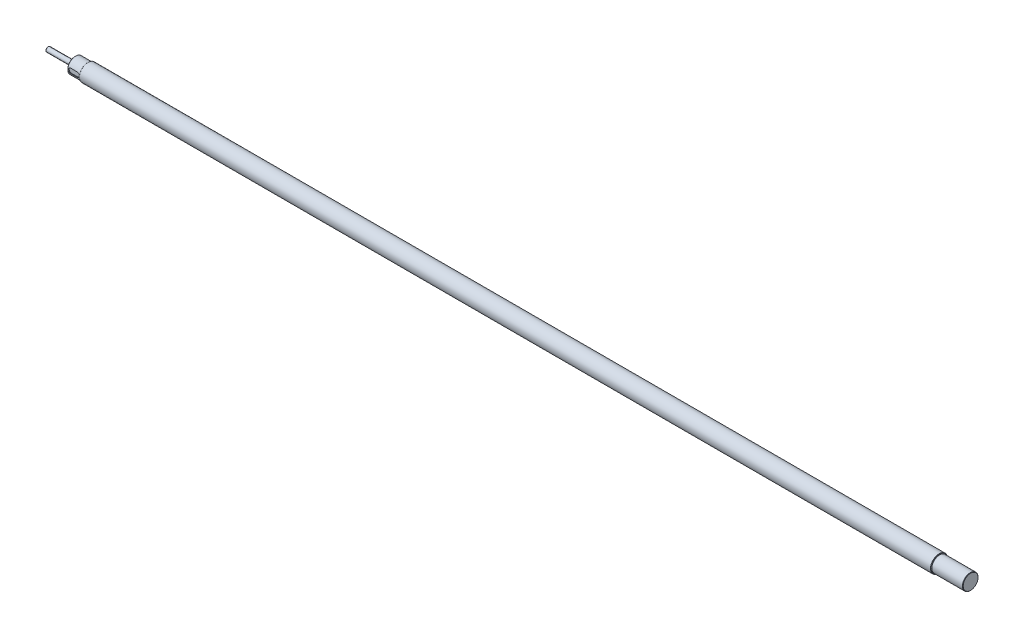
ISO-10303-21;
HEADER;
FILE_DESCRIPTION(('STEP AP214'),'2;1');
FILE_NAME('part.step','',(''),(''),'','','');
FILE_SCHEMA(('AUTOMOTIVE_DESIGN { 1 0 10303 214 1 1 1 1 }'));
ENDSEC;
DATA;
#1=APPLICATION_CONTEXT('core data for automotive mechanical design processes');
#2=APPLICATION_PROTOCOL_DEFINITION('international standard','automotive_design',2000,#1);
#3=PRODUCT_CONTEXT('',#1,'mechanical');
#4=PRODUCT('Part','Part','',(#3));
#5=PRODUCT_RELATED_PRODUCT_CATEGORY('part','',(#4));
#6=PRODUCT_DEFINITION_FORMATION('','',#4);
#7=PRODUCT_DEFINITION_CONTEXT('part definition',#1,'design');
#8=PRODUCT_DEFINITION('design','',#6,#7);
#9=PRODUCT_DEFINITION_SHAPE('','',#8);
#10=(LENGTH_UNIT() NAMED_UNIT(*) SI_UNIT(.MILLI.,.METRE.));
#11=(NAMED_UNIT(*) PLANE_ANGLE_UNIT() SI_UNIT($,.RADIAN.));
#12=(NAMED_UNIT(*) SI_UNIT($,.STERADIAN.) SOLID_ANGLE_UNIT());
#13=UNCERTAINTY_MEASURE_WITH_UNIT(LENGTH_MEASURE(1.E-05),#10,'distance_accuracy_value','');
#14=(GEOMETRIC_REPRESENTATION_CONTEXT(3) GLOBAL_UNCERTAINTY_ASSIGNED_CONTEXT((#13)) GLOBAL_UNIT_ASSIGNED_CONTEXT((#10,
#11,#12)) REPRESENTATION_CONTEXT('',''));
#15=CARTESIAN_POINT('',(0.,0.,0.));
#16=DIRECTION('',(0.,0.,1.));
#17=DIRECTION('',(1.,0.,0.));
#18=AXIS2_PLACEMENT_3D('',#15,#16,#17);
#19=CARTESIAN_POINT('',(51.,-1.17961196366423E-12,0.));
#20=DIRECTION('',(-1.,0.,0.));
#21=DIRECTION('',(0.,0.,1.));
#22=AXIS2_PLACEMENT_3D('',#19,#20,#21);
#23=PLANE('',#22);
#24=CARTESIAN_POINT('',(51.,0.,0.));
#25=DIRECTION('',(-1.,0.,0.));
#26=DIRECTION('',(0.,0.,1.));
#27=AXIS2_PLACEMENT_3D('',#24,#25,#26);
#28=CIRCLE('',#27,10.5);
#29=CARTESIAN_POINT('',(51.,0.,10.5));
#30=VERTEX_POINT('',#29);
#31=EDGE_CURVE('E123',#30,#30,#28,.T.);
#32=ORIENTED_EDGE('',*,*,#31,.T.);
#33=EDGE_LOOP('',(#32));
#34=FACE_BOUND('',#33,.T.);
#35=CARTESIAN_POINT('',(51.,0.,0.));
#36=DIRECTION('',(-1.,0.,0.));
#37=DIRECTION('',(0.,0.,1.));
#38=AXIS2_PLACEMENT_3D('',#35,#36,#37);
#39=CIRCLE('',#38,10.2);
#40=CARTESIAN_POINT('',(51.,0.,10.2));
#41=VERTEX_POINT('',#40);
#42=EDGE_CURVE('E189',#41,#41,#39,.T.);
#43=ORIENTED_EDGE('',*,*,#42,.F.);
#44=EDGE_LOOP('',(#43));
#45=FACE_BOUND('',#44,.T.);
#46=ADVANCED_FACE('F41',(#34,#45),#23,.T.);
#47=CARTESIAN_POINT('',(50.8,0.,0.));
#48=DIRECTION('',(-1.,0.,0.));
#49=DIRECTION('',(0.,0.,1.));
#50=AXIS2_PLACEMENT_3D('',#47,#48,#49);
#51=TOROIDAL_SURFACE('',#50,10.2,0.199999999999995);
#52=CARTESIAN_POINT('',(50.8,0.,0.));
#53=DIRECTION('',(-1.,0.,0.));
#54=DIRECTION('',(0.,0.,1.));
#55=AXIS2_PLACEMENT_3D('',#52,#53,#54);
#56=CIRCLE('',#55,10.);
#57=CARTESIAN_POINT('',(50.8,0.,10.));
#58=VERTEX_POINT('',#57);
#59=EDGE_CURVE('E185',#58,#58,#56,.T.);
#60=ORIENTED_EDGE('',*,*,#59,.F.);
#61=EDGE_LOOP('',(#60));
#62=FACE_BOUND('',#61,.T.);
#63=ORIENTED_EDGE('',*,*,#42,.T.);
#64=EDGE_LOOP('',(#63));
#65=FACE_BOUND('',#64,.T.);
#66=ADVANCED_FACE('F233',(#62,#65),#51,.F.);
#67=CARTESIAN_POINT('',(0.,0.,0.));
#68=DIRECTION('',(-1.,0.,0.));
#69=DIRECTION('',(0.,0.,1.));
#70=AXIS2_PLACEMENT_3D('',#67,#68,#69);
#71=CYLINDRICAL_SURFACE('',#70,10.);
#72=CARTESIAN_POINT('',(47.,-3.,9.53939201416946));
#73=CARTESIAN_POINT('',(47.0823355208227,-3.00001027845728,9.53938054248207));
#74=CARTESIAN_POINT('',(47.1646644550632,-2.99661062684472,9.54045772064378));
#75=CARTESIAN_POINT('',(47.3286939527655,-2.98307142899347,9.54470412105986));
#76=CARTESIAN_POINT('',(47.4103946533244,-2.97293339805418,9.54787287296849));
#77=CARTESIAN_POINT('',(47.5723849156732,-2.94603140625045,9.55620668351003));
#78=CARTESIAN_POINT('',(47.652677524043,-2.92928426957737,9.56136667250114));
#79=CARTESIAN_POINT('',(47.8114758441342,-2.88932853030394,9.57351626651178));
#80=CARTESIAN_POINT('',(47.8899815090674,-2.8661197587264,9.58050591937828));
#81=CARTESIAN_POINT('',(48.1219493879902,-2.78708584446024,9.60391637654137));
#82=CARTESIAN_POINT('',(48.272068438833,-2.72181852542972,9.62279007830391));
#83=CARTESIAN_POINT('',(48.5592260439791,-2.56815043531276,9.66493213967819));
#84=CARTESIAN_POINT('',(48.6962584707622,-2.47973889924159,9.68820254290641));
#85=CARTESIAN_POINT('',(48.9577229879478,-2.27929879634442,9.73733650515375));
#86=CARTESIAN_POINT('',(49.0816848740609,-2.16666914746584,9.76325505469874));
#87=CARTESIAN_POINT('',(49.3092736148388,-1.92227736150432,9.81429628475077));
#88=CARTESIAN_POINT('',(49.412897033861,-1.79051199848163,9.8394188301941));
#89=CARTESIAN_POINT('',(49.5989268650946,-1.50821997465696,9.88666477976535));
#90=CARTESIAN_POINT('',(49.6808501797826,-1.35736167401015,9.90871541546878));
#91=CARTESIAN_POINT('',(49.8179770040029,-1.04324233568302,9.94668940088144));
#92=CARTESIAN_POINT('',(49.873187403368,-0.879984508687981,9.96261433032403));
#93=CARTESIAN_POINT('',(49.953759551791,-0.550649404820599,9.98615279768398));
#94=CARTESIAN_POINT('',(49.9799297035176,-0.384786253016201,9.99399098526792));
#95=CARTESIAN_POINT('',(50.004234695146,-0.0508471415689268,10.0012640407204));
#96=CARTESIAN_POINT('',(50.0023748426782,0.11722839312534,10.0007004995012));
#97=CARTESIAN_POINT('',(49.9712141793086,0.445143199271825,9.99139205125586));
#98=CARTESIAN_POINT('',(49.9427893091919,0.605074290763029,9.98290831016512));
#99=CARTESIAN_POINT('',(49.8607367303745,0.917780104370315,9.95903027401822));
#100=CARTESIAN_POINT('',(49.8071077013173,1.07055445110879,9.94363561692558));
#101=CARTESIAN_POINT('',(49.6755755564753,1.36669563173912,9.90730429851782));
#102=CARTESIAN_POINT('',(49.5973967112239,1.50993201207613,9.88630511384915));
#103=CARTESIAN_POINT('',(49.4192028199656,1.781531059161,9.84099249303647));
#104=CARTESIAN_POINT('',(49.3191828810593,1.90989038323251,9.81667831471806));
#105=CARTESIAN_POINT('',(49.0956160238154,2.15330901082206,9.7662334714278));
#106=CARTESIAN_POINT('',(48.9713122724738,2.26766702955975,9.74006890899097));
#107=CARTESIAN_POINT('',(48.7050051531489,2.47413538985067,9.68968430229327));
#108=CARTESIAN_POINT('',(48.5629966392702,2.5662392402618,9.66546482675134));
#109=CARTESIAN_POINT('',(48.2634381431001,2.72632814481701,9.62154457591303));
#110=CARTESIAN_POINT('',(48.1057456408129,2.79406012682263,9.60189192491896));
#111=CARTESIAN_POINT('',(47.7805509920369,2.90171772009404,9.56991327306403));
#112=CARTESIAN_POINT('',(47.6130642785713,2.94168586436072,9.5575760695175));
#113=CARTESIAN_POINT('',(47.3700102218596,2.97802407180159,9.54628064650012));
#114=CARTESIAN_POINT('',(47.2962185316408,2.98626405978017,9.54370312550534));
#115=CARTESIAN_POINT('',(47.148297041801,2.99724711229709,9.54025857223565));
#116=CARTESIAN_POINT('',(47.0741679006723,2.99999825936538,9.53938902493288));
#117=CARTESIAN_POINT('',(47.,3.,9.53939201416946));
#118=B_SPLINE_CURVE_WITH_KNOTS('',3,(#72,#73,#74,#75,#76,#77,#78,#79,#80,#81,#82,#83,#84,#85,
#86,#87,#88,#89,#90,#91,#92,#93,#94,#95,#96,#97,#98,#99,#100,#101,#102,#103,#104,#105,#106,#107,
#108,#109,#110,#111,#112,#113,#114,#115,#116,#117),.UNSPECIFIED.,.F.,.F.,(4,2,2,2,2,2,2,2,2,2,2,
2,2,2,2,2,2,2,2,2,2,2,4),(0.,0.246918142439474,0.493780777706094,0.740019009623013,
0.986263681482027,1.47813347402026,1.97023245590779,2.47635119822767,2.98255536239034,
3.49922810620071,4.01576751791672,4.51753600864764,5.01920948804101,5.50490358251093,
5.99062312360831,6.48200583350621,6.9734987373917,7.48389234847122,7.99443465298715,
8.51013494368214,9.02504345105574,9.24774267716779,9.47011372732391),.UNSPECIFIED.);
#119=CARTESIAN_POINT('',(47.,-3.,9.53939201416946));
#120=VERTEX_POINT('',#119);
#121=CARTESIAN_POINT('',(47.,3.,9.53939201416946));
#122=VERTEX_POINT('',#121);
#123=EDGE_CURVE('E193',#120,#122,#118,.T.);
#124=ORIENTED_EDGE('',*,*,#123,.F.);
#125=DIRECTION('',(-1.,0.,0.));
#126=VECTOR('',#125,1.);
#127=CARTESIAN_POINT('',(0.,-3.,9.53939201416946));
#128=LINE('',#127,#126);
#129=CARTESIAN_POINT('',(39.,-3.,9.53939201416946));
#130=VERTEX_POINT('',#129);
#131=EDGE_CURVE('E54',#130,#120,#128,.F.);
#132=ORIENTED_EDGE('',*,*,#131,.F.);
#133=CARTESIAN_POINT('',(39.,3.,9.53939201416946));
#134=CARTESIAN_POINT('',(38.9176644791773,3.00001027845728,9.53938054248207));
#135=CARTESIAN_POINT('',(38.8353355449368,2.99661062684472,9.54045772064379));
#136=CARTESIAN_POINT('',(38.6713060472345,2.98307142899347,9.54470412105986));
#137=CARTESIAN_POINT('',(38.5896053466756,2.97293339805418,9.54787287296849));
#138=CARTESIAN_POINT('',(38.4276150843268,2.94603140625045,9.55620668351003));
#139=CARTESIAN_POINT('',(38.347322475957,2.92928426957737,9.56136667250114));
#140=CARTESIAN_POINT('',(38.1885241558658,2.88932853030394,9.57351626651178));
#141=CARTESIAN_POINT('',(38.1100184909326,2.8661197587264,9.58050591937828));
#142=CARTESIAN_POINT('',(37.8780506120099,2.78708584446024,9.60391637654137));
#143=CARTESIAN_POINT('',(37.727931561167,2.72181852542972,9.62279007830391));
#144=CARTESIAN_POINT('',(37.440773956021,2.56815043531276,9.66493213967819));
#145=CARTESIAN_POINT('',(37.3037415292378,2.47973889924159,9.68820254290641));
#146=CARTESIAN_POINT('',(37.0422770120522,2.27929879634442,9.73733650515375));
#147=CARTESIAN_POINT('',(36.9183151259391,2.16666914746584,9.76325505469874));
#148=CARTESIAN_POINT('',(36.6907263851612,1.92227736150433,9.81429628475077));
#149=CARTESIAN_POINT('',(36.587102966139,1.79051199848163,9.8394188301941));
#150=CARTESIAN_POINT('',(36.4010731349054,1.50821997465696,9.88666477976535));
#151=CARTESIAN_POINT('',(36.3191498202174,1.35736167401015,9.90871541546878));
#152=CARTESIAN_POINT('',(36.1820229959971,1.04324233568303,9.94668940088144));
#153=CARTESIAN_POINT('',(36.1268125966321,0.879984508687982,9.96261433032403));
#154=CARTESIAN_POINT('',(36.046240448209,0.550649404820599,9.98615279768398));
#155=CARTESIAN_POINT('',(36.0200702964824,0.384786253016201,9.99399098526792));
#156=CARTESIAN_POINT('',(35.995765304854,0.0508471415689266,10.0012640407204));
#157=CARTESIAN_POINT('',(35.9976251573218,-0.11722839312534,10.0007004995012));
#158=CARTESIAN_POINT('',(36.0287858206914,-0.445143199271825,9.99139205125586));
#159=CARTESIAN_POINT('',(36.0572106908081,-0.605074290763029,9.98290831016512));
#160=CARTESIAN_POINT('',(36.1392632696255,-0.917780104370315,9.95903027401822));
#161=CARTESIAN_POINT('',(36.1928922986827,-1.07055445110879,9.94363561692558));
#162=CARTESIAN_POINT('',(36.3244244435248,-1.36669563173912,9.90730429851782));
#163=CARTESIAN_POINT('',(36.4026032887761,-1.50993201207613,9.88630511384915));
#164=CARTESIAN_POINT('',(36.5807971800344,-1.78153105916101,9.84099249303647));
#165=CARTESIAN_POINT('',(36.6808171189407,-1.90989038323251,9.81667831471806));
#166=CARTESIAN_POINT('',(36.9043839761846,-2.15330901082206,9.7662334714278));
#167=CARTESIAN_POINT('',(37.0286877275262,-2.26766702955976,9.74006890899097));
#168=CARTESIAN_POINT('',(37.2949948468511,-2.47413538985067,9.68968430229327));
#169=CARTESIAN_POINT('',(37.4370033607298,-2.5662392402618,9.66546482675134));
#170=CARTESIAN_POINT('',(37.7365618568999,-2.72632814481701,9.62154457591303));
#171=CARTESIAN_POINT('',(37.8942543591872,-2.79406012682263,9.60189192491895));
#172=CARTESIAN_POINT('',(38.2194490079632,-2.90171772009405,9.56991327306402));
#173=CARTESIAN_POINT('',(38.3869357214287,-2.94168586436072,9.5575760695175));
#174=CARTESIAN_POINT('',(38.6299897781404,-2.97802407180159,9.54628064650012));
#175=CARTESIAN_POINT('',(38.7037814683592,-2.98626405978017,9.54370312550533));
#176=CARTESIAN_POINT('',(38.8517029581991,-2.99724711229709,9.54025857223564));
#177=CARTESIAN_POINT('',(38.9258320993277,-2.99999825936538,9.53938902493288));
#178=CARTESIAN_POINT('',(39.,-3.,9.53939201416946));
#179=B_SPLINE_CURVE_WITH_KNOTS('',3,(#133,#134,#135,#136,#137,#138,#139,#140,#141,#142,#143,
#144,#145,#146,#147,#148,#149,#150,#151,#152,#153,#154,#155,#156,#157,#158,#159,#160,#161,#162,
#163,#164,#165,#166,#167,#168,#169,#170,#171,#172,#173,#174,#175,#176,#177,#178),.UNSPECIFIED.,
.F.,.F.,(4,2,2,2,2,2,2,2,2,2,2,2,2,2,2,2,2,2,2,2,2,2,4),(0.,0.246918142439467,0.493780777706094,
0.740019009623013,0.986263681482026,1.47813347402026,1.97023245590779,2.47635119822767,
2.98255536239034,3.49922810620071,4.01576751791672,4.51753600864764,5.019209488041,
5.50490358251093,5.99062312360831,6.48200583350621,6.9734987373917,7.48389234847122,
7.99443465298715,8.51013494368214,9.02504345105574,9.24774267716779,9.47011372732391),.UNSPECIFIED.);
#180=CARTESIAN_POINT('',(39.,3.,9.53939201416946));
#181=VERTEX_POINT('',#180);
#182=EDGE_CURVE('E68',#181,#130,#179,.T.);
#183=ORIENTED_EDGE('',*,*,#182,.F.);
#184=DIRECTION('',(-1.,0.,0.));
#185=VECTOR('',#184,1.);
#186=CARTESIAN_POINT('',(0.,3.,9.53939201416946));
#187=LINE('',#186,#185);
#188=EDGE_CURVE('E202',#122,#181,#187,.T.);
#189=ORIENTED_EDGE('',*,*,#188,.F.);
#190=EDGE_LOOP('',(#124,#132,#183,#189));
#191=FACE_BOUND('',#190,.T.);
#192=ORIENTED_EDGE('',*,*,#59,.T.);
#193=EDGE_LOOP('',(#192));
#194=FACE_BOUND('',#193,.T.);
#195=CARTESIAN_POINT('',(35.5,0.,0.));
#196=DIRECTION('',(-1.,0.,0.));
#197=DIRECTION('',(0.,0.,1.));
#198=AXIS2_PLACEMENT_3D('',#195,#196,#197);
#199=CIRCLE('',#198,10.);
#200=CARTESIAN_POINT('',(35.5,0.,10.));
#201=VERTEX_POINT('',#200);
#202=EDGE_CURVE('E181',#201,#201,#199,.T.);
#203=ORIENTED_EDGE('',*,*,#202,.F.);
#204=EDGE_LOOP('',(#203));
#205=FACE_BOUND('',#204,.T.);
#206=ADVANCED_FACE('F204',(#191,#194,#205),#71,.T.);
#207=CARTESIAN_POINT('',(35.,0.,0.));
#208=DIRECTION('',(1.,0.,0.));
#209=DIRECTION('',(0.,0.,-1.));
#210=AXIS2_PLACEMENT_3D('',#207,#208,#209);
#211=CONICAL_SURFACE('',#210,9.5,0.785398163397448);
#212=ORIENTED_EDGE('',*,*,#202,.T.);
#213=EDGE_LOOP('',(#212));
#214=FACE_BOUND('',#213,.T.);
#215=CARTESIAN_POINT('',(35.,0.,0.));
#216=DIRECTION('',(-1.,0.,0.));
#217=DIRECTION('',(0.,0.,1.));
#218=AXIS2_PLACEMENT_3D('',#215,#216,#217);
#219=CIRCLE('',#218,9.5);
#220=CARTESIAN_POINT('',(35.,0.,9.5));
#221=VERTEX_POINT('',#220);
#222=EDGE_CURVE('E177',#221,#221,#219,.T.);
#223=ORIENTED_EDGE('',*,*,#222,.F.);
#224=EDGE_LOOP('',(#223));
#225=FACE_BOUND('',#224,.T.);
#226=ADVANCED_FACE('F232',(#214,#225),#211,.T.);
#227=CARTESIAN_POINT('',(35.,0.,0.));
#228=DIRECTION('',(-1.,0.,0.));
#229=DIRECTION('',(0.,0.,1.));
#230=AXIS2_PLACEMENT_3D('',#227,#228,#229);
#231=PLANE('',#230);
#232=ORIENTED_EDGE('',*,*,#222,.T.);
#233=EDGE_LOOP('',(#232));
#234=FACE_BOUND('',#233,.T.);
#235=CARTESIAN_POINT('',(35.,0.,0.));
#236=DIRECTION('',(-1.,0.,0.));
#237=DIRECTION('',(0.,0.,1.));
#238=AXIS2_PLACEMENT_3D('',#235,#236,#237);
#239=CIRCLE('',#238,3.5);
#240=CARTESIAN_POINT('',(35.,0.,3.5));
#241=VERTEX_POINT('',#240);
#242=EDGE_CURVE('E173',#241,#241,#239,.T.);
#243=ORIENTED_EDGE('',*,*,#242,.F.);
#244=EDGE_LOOP('',(#243));
#245=FACE_BOUND('',#244,.T.);
#246=ADVANCED_FACE('F240',(#234,#245),#231,.T.);
#247=CARTESIAN_POINT('',(34.5,0.,0.));
#248=DIRECTION('',(-1.,0.,0.));
#249=DIRECTION('',(0.,0.,1.));
#250=AXIS2_PLACEMENT_3D('',#247,#248,#249);
#251=TOROIDAL_SURFACE('',#250,3.5,0.5);
#252=ORIENTED_EDGE('',*,*,#242,.T.);
#253=EDGE_LOOP('',(#252));
#254=FACE_BOUND('',#253,.T.);
#255=CARTESIAN_POINT('',(34.5,0.,0.));
#256=DIRECTION('',(-1.,0.,0.));
#257=DIRECTION('',(0.,0.,1.));
#258=AXIS2_PLACEMENT_3D('',#255,#256,#257);
#259=CIRCLE('',#258,3.);
#260=CARTESIAN_POINT('',(34.5,0.,3.));
#261=VERTEX_POINT('',#260);
#262=EDGE_CURVE('E169',#261,#261,#259,.T.);
#263=ORIENTED_EDGE('',*,*,#262,.F.);
#264=EDGE_LOOP('',(#263));
#265=FACE_BOUND('',#264,.T.);
#266=ADVANCED_FACE('F245',(#254,#265),#251,.F.);
#267=CARTESIAN_POINT('',(0.,0.,0.));
#268=DIRECTION('',(-1.,0.,0.));
#269=DIRECTION('',(0.,0.,1.));
#270=AXIS2_PLACEMENT_3D('',#267,#268,#269);
#271=CYLINDRICAL_SURFACE('',#270,3.);
#272=ORIENTED_EDGE('',*,*,#262,.T.);
#273=EDGE_LOOP('',(#272));
#274=FACE_BOUND('',#273,.T.);
#275=CARTESIAN_POINT('',(0.5,0.,0.));
#276=DIRECTION('',(-1.,0.,0.));
#277=DIRECTION('',(0.,0.,1.));
#278=AXIS2_PLACEMENT_3D('',#275,#276,#277);
#279=CIRCLE('',#278,3.);
#280=CARTESIAN_POINT('',(0.5,0.,3.));
#281=VERTEX_POINT('',#280);
#282=EDGE_CURVE('E165',#281,#281,#279,.T.);
#283=ORIENTED_EDGE('',*,*,#282,.F.);
#284=EDGE_LOOP('',(#283));
#285=FACE_BOUND('',#284,.T.);
#286=ADVANCED_FACE('F251',(#274,#285),#271,.T.);
#287=CARTESIAN_POINT('',(0.,0.,0.));
#288=DIRECTION('',(1.,0.,0.));
#289=DIRECTION('',(0.,0.,-1.));
#290=AXIS2_PLACEMENT_3D('',#287,#288,#289);
#291=CONICAL_SURFACE('',#290,2.5,0.785398163397448);
#292=ORIENTED_EDGE('',*,*,#282,.T.);
#293=EDGE_LOOP('',(#292));
#294=FACE_BOUND('',#293,.T.);
#295=CARTESIAN_POINT('',(0.,0.,0.));
#296=DIRECTION('',(-1.,0.,0.));
#297=DIRECTION('',(0.,0.,1.));
#298=AXIS2_PLACEMENT_3D('',#295,#296,#297);
#299=CIRCLE('',#298,2.5);
#300=CARTESIAN_POINT('',(0.,0.,2.5));
#301=VERTEX_POINT('',#300);
#302=EDGE_CURVE('E161',#301,#301,#299,.T.);
#303=ORIENTED_EDGE('',*,*,#302,.F.);
#304=EDGE_LOOP('',(#303));
#305=FACE_BOUND('',#304,.T.);
#306=ADVANCED_FACE('F257',(#294,#305),#291,.T.);
#307=CARTESIAN_POINT('',(0.,0.,0.));
#308=DIRECTION('',(-1.,0.,0.));
#309=DIRECTION('',(0.,0.,1.));
#310=AXIS2_PLACEMENT_3D('',#307,#308,#309);
#311=PLANE('',#310);
#312=ORIENTED_EDGE('',*,*,#302,.T.);
#313=EDGE_LOOP('',(#312));
#314=FACE_BOUND('',#313,.T.);
#315=ADVANCED_FACE('F263',(#314),#311,.T.);
#316=CARTESIAN_POINT('',(1185.,0.,0.));
#317=DIRECTION('',(-1.,0.,0.));
#318=DIRECTION('',(0.,0.,1.));
#319=AXIS2_PLACEMENT_3D('',#316,#317,#318);
#320=PLANE('',#319);
#321=CARTESIAN_POINT('',(1185.,0.,0.));
#322=DIRECTION('',(-1.,0.,0.));
#323=DIRECTION('',(0.,0.,1.));
#324=AXIS2_PLACEMENT_3D('',#321,#322,#323);
#325=CIRCLE('',#324,9.5);
#326=CARTESIAN_POINT('',(1185.,0.,9.5));
#327=VERTEX_POINT('',#326);
#328=EDGE_CURVE('E157',#327,#327,#325,.T.);
#329=ORIENTED_EDGE('',*,*,#328,.F.);
#330=EDGE_LOOP('',(#329));
#331=FACE_BOUND('',#330,.T.);
#332=ADVANCED_FACE('F268',(#331),#320,.F.);
#333=CARTESIAN_POINT('',(1185.,0.,0.));
#334=DIRECTION('',(-1.,0.,0.));
#335=DIRECTION('',(0.,0.,1.));
#336=AXIS2_PLACEMENT_3D('',#333,#334,#335);
#337=CONICAL_SURFACE('',#336,9.5,0.785398163397726);
#338=CARTESIAN_POINT('',(1184.5,0.,0.));
#339=DIRECTION('',(-1.,0.,0.));
#340=DIRECTION('',(0.,0.,1.));
#341=AXIS2_PLACEMENT_3D('',#338,#339,#340);
#342=CIRCLE('',#341,10.);
#343=CARTESIAN_POINT('',(1184.5,0.,10.));
#344=VERTEX_POINT('',#343);
#345=EDGE_CURVE('E153',#344,#344,#342,.T.);
#346=ORIENTED_EDGE('',*,*,#345,.F.);
#347=EDGE_LOOP('',(#346));
#348=FACE_BOUND('',#347,.T.);
#349=ORIENTED_EDGE('',*,*,#328,.T.);
#350=EDGE_LOOP('',(#349));
#351=FACE_BOUND('',#350,.T.);
#352=ADVANCED_FACE('F273',(#348,#351),#337,.T.);
#353=CARTESIAN_POINT('',(0.,0.,0.));
#354=DIRECTION('',(-1.,0.,0.));
#355=DIRECTION('',(0.,0.,1.));
#356=AXIS2_PLACEMENT_3D('',#353,#354,#355);
#357=CYLINDRICAL_SURFACE('',#356,10.);
#358=CARTESIAN_POINT('',(1151.,0.,-10.));
#359=CARTESIAN_POINT('',(1151.00000157493,-0.107549581345539,-9.99999886871264));
#360=CARTESIAN_POINT('',(1151.00434367108,-0.215132147940365,-9.99825999367799));
#361=CARTESIAN_POINT('',(1151.02167338278,-0.429535200549542,-9.99134740691108));
#362=CARTESIAN_POINT('',(1151.0346664534,-0.536355162703284,-9.98617152790588));
#363=CARTESIAN_POINT('',(1151.06920803455,-0.748635856497397,-9.97250573560118));
#364=CARTESIAN_POINT('',(1151.09077505462,-0.854093134440859,-9.96400865312144));
#365=CARTESIAN_POINT('',(1151.14224173044,-1.0626676111401,-9.94393017211573));
#366=CARTESIAN_POINT('',(1151.17214476626,-1.1657838422726,-9.93234752254499));
#367=CARTESIAN_POINT('',(1151.27372280872,-1.4697950968107,-9.89349112162204));
#368=CARTESIAN_POINT('',(1151.35742181901,-1.66629107461991,-9.86204458846134));
#369=CARTESIAN_POINT('',(1151.55404621735,-2.042174178781,-9.79113035538708));
#370=CARTESIAN_POINT('',(1151.66696146011,-2.22156721456798,-9.75166544086262));
#371=CARTESIAN_POINT('',(1151.92446875452,-2.5669933993821,-9.66661825353091));
#372=CARTESIAN_POINT('',(1152.07021271058,-2.7321222326651,-9.62084608086598));
#373=CARTESIAN_POINT('',(1152.38680060915,-3.03635232313266,-9.5292113957723));
#374=CARTESIAN_POINT('',(1152.55765675902,-3.17544084661155,-9.48334885017046));
#375=CARTESIAN_POINT('',(1152.92885596857,-3.42974847409894,-9.39445587657958));
#376=CARTESIAN_POINT('',(1153.13017292606,-3.54362978572888,-9.35164233015934));
#377=CARTESIAN_POINT('',(1153.5510728428,-3.73550961465234,-9.2766729328807));
#378=CARTESIAN_POINT('',(1153.77064706774,-3.81352517485724,-9.24451202207145));
#379=CARTESIAN_POINT('',(1154.21142465569,-3.92779760260542,-9.19652715590088));
#380=CARTESIAN_POINT('',(1154.43210246809,-3.96578791979826,-9.18002840771385));
#381=CARTESIAN_POINT('',(1154.87726999968,-4.00434593508727,-9.16328008038143));
#382=CARTESIAN_POINT('',(1155.10175779001,-4.00493203570086,-9.16302251073203));
#383=CARTESIAN_POINT('',(1155.53151334222,-3.96997873214739,-9.17821000534302));
#384=CARTESIAN_POINT('',(1155.73703142877,-3.93695062778271,-9.19256349925666));
#385=CARTESIAN_POINT('',(1156.13931911235,-3.83989376129507,-9.23352375055553));
#386=CARTESIAN_POINT('',(1156.33608717631,-3.77585958980135,-9.26013264599921));
#387=CARTESIAN_POINT('',(1156.72003567229,-3.61738946491144,-9.3231897022116));
#388=CARTESIAN_POINT('',(1156.90693847808,-3.52235972457945,-9.35982758573421));
#389=CARTESIAN_POINT('',(1157.26283163275,-3.30501292151573,-9.43876232767925));
#390=CARTESIAN_POINT('',(1157.43181521881,-3.18268561021589,-9.48106130910412));
#391=CARTESIAN_POINT('',(1157.7608194576,-2.90310119889352,-9.57053473488082));
#392=CARTESIAN_POINT('',(1157.91913745889,-2.74387492593716,-9.61783329953252));
#393=CARTESIAN_POINT('',(1158.20736895601,-2.40062885486449,-9.70919649915614));
#394=CARTESIAN_POINT('',(1158.33727679482,-2.21660413066995,-9.75326048890393));
#395=CARTESIAN_POINT('',(1158.56723489483,-1.82415530521048,-9.8342936252936));
#396=CARTESIAN_POINT('',(1158.66664456239,-1.61532098269255,-9.87110540190901));
#397=CARTESIAN_POINT('',(1158.82833572216,-1.18204753096596,-9.93229656657449));
#398=CARTESIAN_POINT('',(1158.89063607512,-0.957616393699341,-9.95668226924746));
#399=CARTESIAN_POINT('',(1158.97289659084,-0.513791775215571,-9.98912279013838));
#400=CARTESIAN_POINT('',(1158.99514490851,-0.294886587971121,-9.99805891667034));
#401=CARTESIAN_POINT('',(1159.00342620106,0.143690619615725,-10.0013695702126));
#402=CARTESIAN_POINT('',(1158.9894685631,0.363362426448202,-9.99574787164577));
#403=CARTESIAN_POINT('',(1158.9274164949,0.786865478243657,-9.97115134127512));
#404=CARTESIAN_POINT('',(1158.8808840393,0.990964983549748,-9.95278782691064));
#405=CARTESIAN_POINT('',(1158.75712858338,1.38827085612274,-9.90518882810983));
#406=CARTESIAN_POINT('',(1158.67990164066,1.58147582045414,-9.87595194712998));
#407=CARTESIAN_POINT('',(1158.49443012064,1.95815757162887,-9.80833189541686));
#408=CARTESIAN_POINT('',(1158.38530905591,2.14115604549355,-9.76969631959847));
#409=CARTESIAN_POINT('',(1158.1401193522,2.48688718251041,-9.68746729490808));
#410=CARTESIAN_POINT('',(1158.00403991419,2.64961168158687,-9.64387186219641));
#411=CARTESIAN_POINT('',(1157.69825997407,2.96144608598875,-9.55290235277182));
#412=CARTESIAN_POINT('',(1157.52693291686,3.10894786734715,-9.5054688285379));
#413=CARTESIAN_POINT('',(1157.16111983411,3.37350239509224,-9.41483345830584));
#414=CARTESIAN_POINT('',(1156.9666299998,3.49055012366588,-9.37163231039243));
#415=CARTESIAN_POINT('',(1156.55707661033,3.69161500286274,-9.29428599829331));
#416=CARTESIAN_POINT('',(1156.34183199976,3.77530118531757,-9.26023261821744));
#417=CARTESIAN_POINT('',(1155.89853269839,3.90459244315901,-9.20647346903739));
#418=CARTESIAN_POINT('',(1155.67048759516,3.95022562452796,-9.18675711197461));
#419=CARTESIAN_POINT('',(1155.22574419016,3.99943122157417,-9.16543518780389));
#420=CARTESIAN_POINT('',(1155.0094102981,4.00579411777209,-9.16262842667612));
#421=CARTESIAN_POINT('',(1154.57891030728,3.98360636538272,-9.1722967141501));
#422=CARTESIAN_POINT('',(1154.36474393672,3.95506015014706,-9.18476982225498));
#423=CARTESIAN_POINT('',(1153.95333553911,3.86614256488123,-9.22253300486272));
#424=CARTESIAN_POINT('',(1153.75575915378,3.80707437387704,-9.2472967218297));
#425=CARTESIAN_POINT('',(1153.37324303821,3.66001151041638,-9.30647993934965));
#426=CARTESIAN_POINT('',(1153.18830681489,3.57200884934549,-9.34090210615105));
#427=CARTESIAN_POINT('',(1152.82477958929,3.36374310804129,-9.41797252826472));
#428=CARTESIAN_POINT('',(1152.64715816931,3.24192140926539,-9.46097893410837));
#429=CARTESIAN_POINT('',(1152.31401785738,2.97179350239171,-9.54927479921253));
#430=CARTESIAN_POINT('',(1152.15850565271,2.82347931168573,-9.59456494363944));
#431=CARTESIAN_POINT('',(1151.86357640747,2.49297412446684,-9.68587647140968));
#432=CARTESIAN_POINT('',(1151.72585661602,2.30921017071937,-9.73175488236397));
#433=CARTESIAN_POINT('',(1151.54395189106,2.01716584575518,-9.79495027625773));
#434=CARTESIAN_POINT('',(1151.48739293615,1.91699501972412,-9.81509269692658));
#435=CARTESIAN_POINT('',(1151.38296200459,1.71180110982468,-9.85294835133021));
#436=CARTESIAN_POINT('',(1151.33508605019,1.6067802755973,-9.87066269647667));
#437=CARTESIAN_POINT('',(1151.24925201532,1.39454646904319,-9.90285599354911));
#438=CARTESIAN_POINT('',(1151.21112984525,1.28740777135866,-9.91738778532478));
#439=CARTESIAN_POINT('',(1151.14407865228,1.0699557752338,-9.94319722915714));
#440=CARTESIAN_POINT('',(1151.11514534265,0.959643983352567,-9.95447639837582));
#441=CARTESIAN_POINT('',(1151.06682516385,0.736945215856779,-9.97343330649399));
#442=CARTESIAN_POINT('',(1151.04741408836,0.624564263591236,-9.98112017494336));
#443=CARTESIAN_POINT('',(1151.01826142933,0.39841913240757,-9.99270031578293));
#444=CARTESIAN_POINT('',(1151.00851297317,0.28465599496632,-9.99659628445551));
#445=CARTESIAN_POINT('',(1151.00121410443,0.113830463425469,-9.99951445883957));
#446=CARTESIAN_POINT('',(1150.99999916648,0.0569198512645184,-10.0000005987258));
#447=CARTESIAN_POINT('',(1151.,0.,-10.));
#448=B_SPLINE_CURVE_WITH_KNOTS('',3,(#358,#359,#360,#361,#362,#363,#364,#365,#366,#367,#368,
#369,#370,#371,#372,#373,#374,#375,#376,#377,#378,#379,#380,#381,#382,#383,#384,#385,#386,#387,
#388,#389,#390,#391,#392,#393,#394,#395,#396,#397,#398,#399,#400,#401,#402,#403,#404,#405,#406,
#407,#408,#409,#410,#411,#412,#413,#414,#415,#416,#417,#418,#419,#420,#421,#422,#423,#424,#425,
#426,#427,#428,#429,#430,#431,#432,#433,#434,#435,#436,#437,#438,#439,#440,#441,#442,#443,#444,
#445,#446,#447),.UNSPECIFIED.,.T.,.F.,(4,2,2,2,2,2,2,2,2,2,2,2,2,2,2,2,2,2,2,2,2,2,2,2,2,2,2,2,
2,2,2,2,2,2,2,2,2,2,2,2,2,2,2,2,4),(0.,0.322603993422162,0.645411604786464,0.968919914471229,
1.29255959093093,1.93701523385821,2.58124739027475,3.25313995292298,3.92536021760337,
4.62749749529943,5.32930078128038,5.99927442509173,6.66891844572495,7.29195888698822,
7.91510806412256,8.55097484497794,9.18708075776533,9.87235930273284,10.5577741757965,
11.2567305822579,11.9553314412776,12.6125760095619,13.2696501904034,13.8972014302891,
14.5248332988776,15.171662586967,15.8187515089811,16.5085618114899,17.1984856998767,
17.8950932218181,18.5911857719204,19.2371857868566,19.883103770263,20.503478689977,
21.1240250351049,21.7801016801355,22.4363763459698,23.1352007896786,23.4851924266233,
23.8350233218042,24.1785111324565,24.52183846562,24.8642884495951,25.2064946871486,
25.3772305569976),.UNSPECIFIED.);
#449=CARTESIAN_POINT('',(1151.,0.,-10.));
#450=VERTEX_POINT('',#449);
#451=EDGE_CURVE('E11',#450,#450,#448,.T.);
#452=ORIENTED_EDGE('',*,*,#451,.T.);
#453=EDGE_LOOP('',(#452));
#454=FACE_BOUND('',#453,.T.);
#455=CARTESIAN_POINT('',(1145.2,0.,0.));
#456=DIRECTION('',(-1.,0.,0.));
#457=DIRECTION('',(0.,0.,1.));
#458=AXIS2_PLACEMENT_3D('',#455,#456,#457);
#459=CIRCLE('',#458,10.);
#460=CARTESIAN_POINT('',(1145.2,0.,10.));
#461=VERTEX_POINT('',#460);
#462=EDGE_CURVE('E149',#461,#461,#459,.T.);
#463=ORIENTED_EDGE('',*,*,#462,.F.);
#464=EDGE_LOOP('',(#463));
#465=FACE_BOUND('',#464,.T.);
#466=ORIENTED_EDGE('',*,*,#345,.T.);
#467=EDGE_LOOP('',(#466));
#468=FACE_BOUND('',#467,.T.);
#469=ADVANCED_FACE('F313',(#454,#465,#468),#357,.T.);
#470=CARTESIAN_POINT('',(1145.2,0.,0.));
#471=DIRECTION('',(-1.,0.,0.));
#472=DIRECTION('',(0.,0.,1.));
#473=AXIS2_PLACEMENT_3D('',#470,#471,#472);
#474=TOROIDAL_SURFACE('',#473,10.2,0.199999999999988);
#475=CARTESIAN_POINT('',(1145.,0.,0.));
#476=DIRECTION('',(-1.,0.,0.));
#477=DIRECTION('',(0.,0.,1.));
#478=AXIS2_PLACEMENT_3D('',#475,#476,#477);
#479=CIRCLE('',#478,10.2);
#480=CARTESIAN_POINT('',(1145.,0.,10.2));
#481=VERTEX_POINT('',#480);
#482=EDGE_CURVE('E145',#481,#481,#479,.T.);
#483=ORIENTED_EDGE('',*,*,#482,.F.);
#484=EDGE_LOOP('',(#483));
#485=FACE_BOUND('',#484,.T.);
#486=ORIENTED_EDGE('',*,*,#462,.T.);
#487=EDGE_LOOP('',(#486));
#488=FACE_BOUND('',#487,.T.);
#489=ADVANCED_FACE('F307',(#485,#488),#474,.F.);
#490=CARTESIAN_POINT('',(1145.,0.,0.));
#491=DIRECTION('',(-1.,0.,0.));
#492=DIRECTION('',(0.,0.,1.));
#493=AXIS2_PLACEMENT_3D('',#490,#491,#492);
#494=PLANE('',#493);
#495=CARTESIAN_POINT('',(1145.,0.,0.));
#496=DIRECTION('',(-1.,0.,0.));
#497=DIRECTION('',(0.,0.,1.));
#498=AXIS2_PLACEMENT_3D('',#495,#496,#497);
#499=CIRCLE('',#498,10.5);
#500=CARTESIAN_POINT('',(1145.,0.,10.5));
#501=VERTEX_POINT('',#500);
#502=EDGE_CURVE('E141',#501,#501,#499,.T.);
#503=ORIENTED_EDGE('',*,*,#502,.F.);
#504=EDGE_LOOP('',(#503));
#505=FACE_BOUND('',#504,.T.);
#506=ORIENTED_EDGE('',*,*,#482,.T.);
#507=EDGE_LOOP('',(#506));
#508=FACE_BOUND('',#507,.T.);
#509=ADVANCED_FACE('F301',(#505,#508),#494,.F.);
#510=CARTESIAN_POINT('',(1145.,0.,0.));
#511=DIRECTION('',(-1.,0.,0.));
#512=DIRECTION('',(0.,0.,1.));
#513=AXIS2_PLACEMENT_3D('',#510,#511,#512);
#514=CONICAL_SURFACE('',#513,10.5,0.785398163397726);
#515=CARTESIAN_POINT('',(1144.5,0.,0.));
#516=DIRECTION('',(-1.,0.,0.));
#517=DIRECTION('',(0.,0.,1.));
#518=AXIS2_PLACEMENT_3D('',#515,#516,#517);
#519=CIRCLE('',#518,11.);
#520=CARTESIAN_POINT('',(1144.5,0.,11.));
#521=VERTEX_POINT('',#520);
#522=EDGE_CURVE('E137',#521,#521,#519,.T.);
#523=ORIENTED_EDGE('',*,*,#522,.F.);
#524=EDGE_LOOP('',(#523));
#525=FACE_BOUND('',#524,.T.);
#526=ORIENTED_EDGE('',*,*,#502,.T.);
#527=EDGE_LOOP('',(#526));
#528=FACE_BOUND('',#527,.T.);
#529=ADVANCED_FACE('F293',(#525,#528),#514,.T.);
#530=CARTESIAN_POINT('',(0.,0.,0.));
#531=DIRECTION('',(-1.,0.,0.));
#532=DIRECTION('',(0.,0.,1.));
#533=AXIS2_PLACEMENT_3D('',#530,#531,#532);
#534=CYLINDRICAL_SURFACE('',#533,11.);
#535=CARTESIAN_POINT('',(51.5,0.,0.));
#536=DIRECTION('',(-1.,0.,0.));
#537=DIRECTION('',(0.,0.,1.));
#538=AXIS2_PLACEMENT_3D('',#535,#536,#537);
#539=CIRCLE('',#538,11.);
#540=CARTESIAN_POINT('',(51.5,0.,11.));
#541=VERTEX_POINT('',#540);
#542=EDGE_CURVE('E133',#541,#541,#539,.T.);
#543=ORIENTED_EDGE('',*,*,#542,.F.);
#544=EDGE_LOOP('',(#543));
#545=FACE_BOUND('',#544,.T.);
#546=ORIENTED_EDGE('',*,*,#522,.T.);
#547=EDGE_LOOP('',(#546));
#548=FACE_BOUND('',#547,.T.);
#549=ADVANCED_FACE('F288',(#545,#548),#534,.T.);
#550=CARTESIAN_POINT('',(51.,0.,0.));
#551=DIRECTION('',(1.,0.,0.));
#552=DIRECTION('',(0.,0.,-1.));
#553=AXIS2_PLACEMENT_3D('',#550,#551,#552);
#554=CONICAL_SURFACE('',#553,10.5,0.785398163397452);
#555=ORIENTED_EDGE('',*,*,#542,.T.);
#556=EDGE_LOOP('',(#555));
#557=FACE_BOUND('',#556,.T.);
#558=ORIENTED_EDGE('',*,*,#31,.F.);
#559=EDGE_LOOP('',(#558));
#560=FACE_BOUND('',#559,.T.);
#561=ADVANCED_FACE('F220',(#557,#560),#554,.T.);
#562=CARTESIAN_POINT('',(39.,0.,8.8));
#563=DIRECTION('',(0.,0.,1.));
#564=DIRECTION('',(1.,0.,0.));
#565=AXIS2_PLACEMENT_3D('',#562,#563,#564);
#566=CYLINDRICAL_SURFACE('',#565,3.);
#567=DIRECTION('',(0.,0.,1.));
#568=VECTOR('',#567,1.);
#569=CARTESIAN_POINT('',(39.,3.,8.8));
#570=LINE('',#569,#568);
#571=CARTESIAN_POINT('',(39.,3.,8.8));
#572=VERTEX_POINT('',#571);
#573=EDGE_CURVE('E120',#572,#181,#570,.T.);
#574=ORIENTED_EDGE('',*,*,#573,.T.);
#575=ORIENTED_EDGE('',*,*,#182,.T.);
#576=DIRECTION('',(0.,0.,1.));
#577=VECTOR('',#576,1.);
#578=CARTESIAN_POINT('',(39.,-3.,8.8));
#579=LINE('',#578,#577);
#580=CARTESIAN_POINT('',(39.,-3.,8.8));
#581=VERTEX_POINT('',#580);
#582=EDGE_CURVE('E61',#581,#130,#579,.T.);
#583=ORIENTED_EDGE('',*,*,#582,.F.);
#584=CARTESIAN_POINT('',(39.,0.,8.8));
#585=DIRECTION('',(0.,0.,1.));
#586=DIRECTION('',(1.,0.,0.));
#587=AXIS2_PLACEMENT_3D('',#584,#585,#586);
#588=CIRCLE('',#587,3.);
#589=EDGE_CURVE('E91',#572,#581,#588,.T.);
#590=ORIENTED_EDGE('',*,*,#589,.F.);
#591=EDGE_LOOP('',(#574,#575,#583,#590));
#592=FACE_BOUND('',#591,.T.);
#593=ADVANCED_FACE('F89',(#592),#566,.F.);
#594=CARTESIAN_POINT('',(39.,3.,8.8));
#595=DIRECTION('',(0.,1.,0.));
#596=DIRECTION('',(0.,0.,1.));
#597=AXIS2_PLACEMENT_3D('',#594,#595,#596);
#598=PLANE('',#597);
#599=ORIENTED_EDGE('',*,*,#188,.T.);
#600=ORIENTED_EDGE('',*,*,#573,.F.);
#601=DIRECTION('',(-1.,0.,0.));
#602=VECTOR('',#601,1.);
#603=CARTESIAN_POINT('',(39.,3.,8.8));
#604=LINE('',#603,#602);
#605=CARTESIAN_POINT('',(47.,3.,8.8));
#606=VERTEX_POINT('',#605);
#607=EDGE_CURVE('E95',#606,#572,#604,.T.);
#608=ORIENTED_EDGE('',*,*,#607,.F.);
#609=DIRECTION('',(0.,0.,1.));
#610=VECTOR('',#609,1.);
#611=CARTESIAN_POINT('',(47.,3.,8.8));
#612=LINE('',#611,#610);
#613=EDGE_CURVE('E124',#606,#122,#612,.T.);
#614=ORIENTED_EDGE('',*,*,#613,.T.);
#615=EDGE_LOOP('',(#599,#600,#608,#614));
#616=FACE_BOUND('',#615,.T.);
#617=ADVANCED_FACE('F212',(#616),#598,.F.);
#618=CARTESIAN_POINT('',(47.,0.,8.8));
#619=DIRECTION('',(0.,0.,1.));
#620=DIRECTION('',(1.,0.,0.));
#621=AXIS2_PLACEMENT_3D('',#618,#619,#620);
#622=CYLINDRICAL_SURFACE('',#621,3.);
#623=DIRECTION('',(0.,0.,1.));
#624=VECTOR('',#623,1.);
#625=CARTESIAN_POINT('',(47.,-3.,8.8));
#626=LINE('',#625,#624);
#627=CARTESIAN_POINT('',(47.,-3.,8.8));
#628=VERTEX_POINT('',#627);
#629=EDGE_CURVE('E94',#628,#120,#626,.T.);
#630=ORIENTED_EDGE('',*,*,#629,.T.);
#631=ORIENTED_EDGE('',*,*,#123,.T.);
#632=ORIENTED_EDGE('',*,*,#613,.F.);
#633=CARTESIAN_POINT('',(47.,0.,8.8));
#634=DIRECTION('',(0.,0.,1.));
#635=DIRECTION('',(1.,0.,0.));
#636=AXIS2_PLACEMENT_3D('',#633,#634,#635);
#637=CIRCLE('',#636,3.);
#638=EDGE_CURVE('E105',#628,#606,#637,.T.);
#639=ORIENTED_EDGE('',*,*,#638,.F.);
#640=EDGE_LOOP('',(#630,#631,#632,#639));
#641=FACE_BOUND('',#640,.T.);
#642=ADVANCED_FACE('F207',(#641),#622,.F.);
#643=CARTESIAN_POINT('',(39.,-3.,8.8));
#644=DIRECTION('',(0.,-1.,0.));
#645=DIRECTION('',(0.,0.,-1.));
#646=AXIS2_PLACEMENT_3D('',#643,#644,#645);
#647=PLANE('',#646);
#648=ORIENTED_EDGE('',*,*,#131,.T.);
#649=ORIENTED_EDGE('',*,*,#629,.F.);
#650=DIRECTION('',(1.,0.,0.));
#651=VECTOR('',#650,1.);
#652=CARTESIAN_POINT('',(39.,-3.,8.8));
#653=LINE('',#652,#651);
#654=EDGE_CURVE('E98',#581,#628,#653,.T.);
#655=ORIENTED_EDGE('',*,*,#654,.F.);
#656=ORIENTED_EDGE('',*,*,#582,.T.);
#657=EDGE_LOOP('',(#648,#649,#655,#656));
#658=FACE_BOUND('',#657,.T.);
#659=ADVANCED_FACE('F99',(#658),#647,.F.);
#660=CARTESIAN_POINT('',(39.,0.,8.8));
#661=DIRECTION('',(0.,0.,1.));
#662=DIRECTION('',(1.,0.,0.));
#663=AXIS2_PLACEMENT_3D('',#660,#661,#662);
#664=PLANE('',#663);
#665=ORIENTED_EDGE('',*,*,#589,.T.);
#666=ORIENTED_EDGE('',*,*,#654,.T.);
#667=ORIENTED_EDGE('',*,*,#638,.T.);
#668=ORIENTED_EDGE('',*,*,#607,.T.);
#669=EDGE_LOOP('',(#665,#666,#667,#668));
#670=FACE_BOUND('',#669,.T.);
#671=ADVANCED_FACE('F107',(#670),#664,.T.);
#672=CARTESIAN_POINT('',(1155.,0.,-5.));
#673=DIRECTION('',(0.,0.,-1.));
#674=DIRECTION('',(-1.,0.,0.));
#675=AXIS2_PLACEMENT_3D('',#672,#673,#674);
#676=CYLINDRICAL_SURFACE('',#675,3.99999999999999);
#677=CARTESIAN_POINT('',(1155.,0.,-5.));
#678=DIRECTION('',(0.,0.,-1.));
#679=DIRECTION('',(-1.,0.,0.));
#680=AXIS2_PLACEMENT_3D('',#677,#678,#679);
#681=CIRCLE('',#680,3.99999999999999);
#682=CARTESIAN_POINT('',(1151.,0.,-5.));
#683=VERTEX_POINT('',#682);
#684=EDGE_CURVE('E110',#683,#683,#681,.T.);
#685=ORIENTED_EDGE('',*,*,#684,.F.);
#686=EDGE_LOOP('',(#685));
#687=FACE_BOUND('',#686,.T.);
#688=ORIENTED_EDGE('',*,*,#451,.F.);
#689=EDGE_LOOP('',(#688));
#690=FACE_BOUND('',#689,.T.);
#691=ADVANCED_FACE('F397',(#687,#690),#676,.F.);
#692=CARTESIAN_POINT('',(1155.,0.,-5.));
#693=DIRECTION('',(0.,0.,-1.));
#694=DIRECTION('',(-1.,0.,0.));
#695=AXIS2_PLACEMENT_3D('',#692,#693,#694);
#696=PLANE('',#695);
#697=ORIENTED_EDGE('',*,*,#684,.T.);
#698=EDGE_LOOP('',(#697));
#699=FACE_BOUND('',#698,.T.);
#700=ADVANCED_FACE('F405',(#699),#696,.T.);
#701=CLOSED_SHELL('',(#46,#66,#206,#226,#246,#266,#286,#306,#315,#332,#352,#469,#489,#509,#529,
#549,#561,#593,#617,#642,#659,#671,#691,#700));
#702=MANIFOLD_SOLID_BREP('B2',#701);
#703=ADVANCED_BREP_SHAPE_REPRESENTATION('',(#18,#702),#14);
#704=SHAPE_DEFINITION_REPRESENTATION(#9,#703);
ENDSEC;
END-ISO-10303-21;
